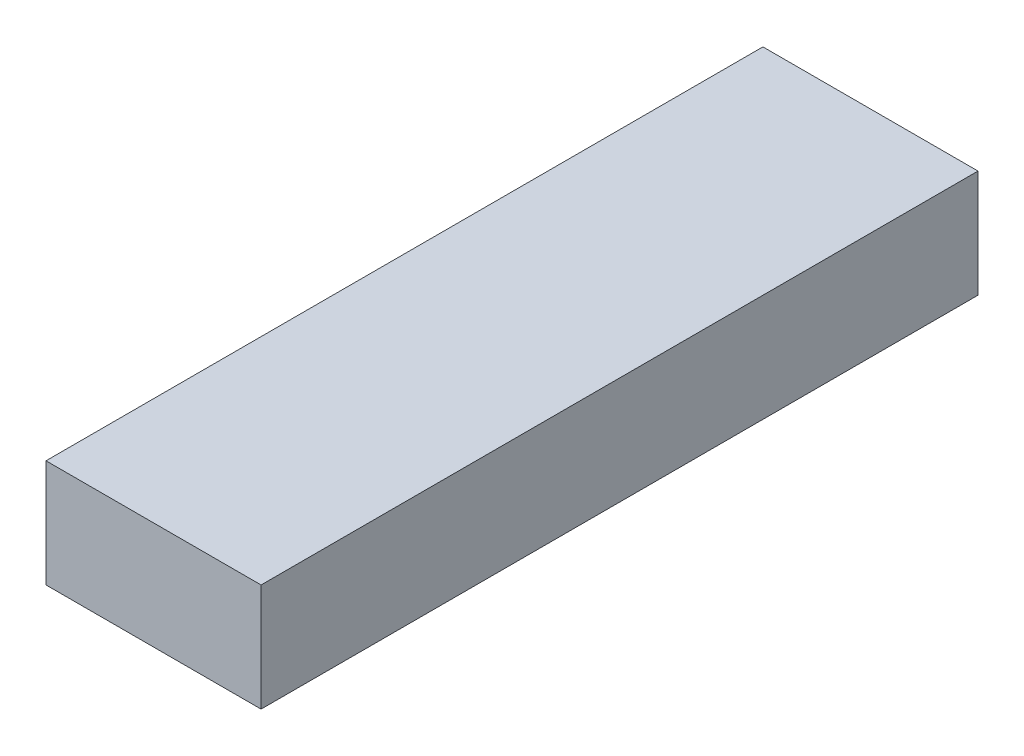
ISO-10303-21;
HEADER;
FILE_DESCRIPTION(('STEP AP214'),'2;1');
FILE_NAME('part.step','',(''),(''),'','','');
FILE_SCHEMA(('AUTOMOTIVE_DESIGN { 1 0 10303 214 1 1 1 1 }'));
ENDSEC;
DATA;
#1=APPLICATION_CONTEXT('core data for automotive mechanical design processes');
#2=APPLICATION_PROTOCOL_DEFINITION('international standard','automotive_design',2000,#1);
#3=PRODUCT_CONTEXT('',#1,'mechanical');
#4=PRODUCT('Part','Part','',(#3));
#5=PRODUCT_RELATED_PRODUCT_CATEGORY('part','',(#4));
#6=PRODUCT_DEFINITION_FORMATION('','',#4);
#7=PRODUCT_DEFINITION_CONTEXT('part definition',#1,'design');
#8=PRODUCT_DEFINITION('design','',#6,#7);
#9=PRODUCT_DEFINITION_SHAPE('','',#8);
#10=(LENGTH_UNIT() NAMED_UNIT(*) SI_UNIT(.MILLI.,.METRE.));
#11=(NAMED_UNIT(*) PLANE_ANGLE_UNIT() SI_UNIT($,.RADIAN.));
#12=(NAMED_UNIT(*) SI_UNIT($,.STERADIAN.) SOLID_ANGLE_UNIT());
#13=UNCERTAINTY_MEASURE_WITH_UNIT(LENGTH_MEASURE(1.E-05),#10,'distance_accuracy_value','');
#14=(GEOMETRIC_REPRESENTATION_CONTEXT(3) GLOBAL_UNCERTAINTY_ASSIGNED_CONTEXT((#13)) GLOBAL_UNIT_ASSIGNED_CONTEXT((#10,
#11,#12)) REPRESENTATION_CONTEXT('',''));
#15=CARTESIAN_POINT('',(0.,0.,0.));
#16=DIRECTION('',(0.,0.,1.));
#17=DIRECTION('',(1.,0.,0.));
#18=AXIS2_PLACEMENT_3D('',#15,#16,#17);
#19=CARTESIAN_POINT('',(-30.,15.,200.));
#20=DIRECTION('',(1.,0.,0.));
#21=DIRECTION('',(0.,0.,-1.));
#22=AXIS2_PLACEMENT_3D('',#19,#20,#21);
#23=PLANE('',#22);
#24=DIRECTION('',(0.,-1.,0.));
#25=VECTOR('',#24,1.);
#26=CARTESIAN_POINT('',(-30.,15.,0.));
#27=LINE('',#26,#25);
#28=CARTESIAN_POINT('',(-30.,15.,0.));
#29=VERTEX_POINT('',#28);
#30=CARTESIAN_POINT('',(-30.,-15.,0.));
#31=VERTEX_POINT('',#30);
#32=EDGE_CURVE('E96',#29,#31,#27,.T.);
#33=ORIENTED_EDGE('',*,*,#32,.T.);
#34=DIRECTION('',(0.,0.,-1.));
#35=VECTOR('',#34,1.);
#36=CARTESIAN_POINT('',(-30.,-15.,200.));
#37=LINE('',#36,#35);
#38=CARTESIAN_POINT('',(-30.,-15.,200.));
#39=VERTEX_POINT('',#38);
#40=EDGE_CURVE('E11',#39,#31,#37,.T.);
#41=ORIENTED_EDGE('',*,*,#40,.F.);
#42=DIRECTION('',(0.,-1.,0.));
#43=VECTOR('',#42,1.);
#44=CARTESIAN_POINT('',(-30.,15.,200.));
#45=LINE('',#44,#43);
#46=CARTESIAN_POINT('',(-30.,15.,200.));
#47=VERTEX_POINT('',#46);
#48=EDGE_CURVE('E84',#47,#39,#45,.T.);
#49=ORIENTED_EDGE('',*,*,#48,.F.);
#50=DIRECTION('',(0.,0.,-1.));
#51=VECTOR('',#50,1.);
#52=CARTESIAN_POINT('',(-30.,15.,200.));
#53=LINE('',#52,#51);
#54=EDGE_CURVE('E92',#47,#29,#53,.T.);
#55=ORIENTED_EDGE('',*,*,#54,.T.);
#56=EDGE_LOOP('',(#33,#41,#49,#55));
#57=FACE_BOUND('',#56,.T.);
#58=ADVANCED_FACE('F33',(#57),#23,.F.);
#59=CARTESIAN_POINT('',(-30.,-15.,200.));
#60=DIRECTION('',(0.,1.,0.));
#61=DIRECTION('',(-1.,0.,0.));
#62=AXIS2_PLACEMENT_3D('',#59,#60,#61);
#63=PLANE('',#62);
#64=DIRECTION('',(1.,0.,0.));
#65=VECTOR('',#64,1.);
#66=CARTESIAN_POINT('',(-30.,-15.,0.));
#67=LINE('',#66,#65);
#68=CARTESIAN_POINT('',(30.,-15.,0.));
#69=VERTEX_POINT('',#68);
#70=EDGE_CURVE('E88',#31,#69,#67,.T.);
#71=ORIENTED_EDGE('',*,*,#70,.T.);
#72=DIRECTION('',(0.,0.,-1.));
#73=VECTOR('',#72,1.);
#74=CARTESIAN_POINT('',(30.,-15.,200.));
#75=LINE('',#74,#73);
#76=CARTESIAN_POINT('',(30.,-15.,200.));
#77=VERTEX_POINT('',#76);
#78=EDGE_CURVE('E41',#77,#69,#75,.T.);
#79=ORIENTED_EDGE('',*,*,#78,.F.);
#80=DIRECTION('',(1.,0.,0.));
#81=VECTOR('',#80,1.);
#82=CARTESIAN_POINT('',(-30.,-15.,200.));
#83=LINE('',#82,#81);
#84=EDGE_CURVE('E79',#39,#77,#83,.T.);
#85=ORIENTED_EDGE('',*,*,#84,.F.);
#86=ORIENTED_EDGE('',*,*,#40,.T.);
#87=EDGE_LOOP('',(#71,#79,#85,#86));
#88=FACE_BOUND('',#87,.T.);
#89=ADVANCED_FACE('F87',(#88),#63,.F.);
#90=CARTESIAN_POINT('',(30.,15.,200.));
#91=DIRECTION('',(-1.,0.,0.));
#92=DIRECTION('',(0.,-1.,0.));
#93=AXIS2_PLACEMENT_3D('',#90,#91,#92);
#94=PLANE('',#93);
#95=DIRECTION('',(0.,1.,0.));
#96=VECTOR('',#95,1.);
#97=CARTESIAN_POINT('',(30.,15.,0.));
#98=LINE('',#97,#96);
#99=CARTESIAN_POINT('',(30.,15.,0.));
#100=VERTEX_POINT('',#99);
#101=EDGE_CURVE('E66',#69,#100,#98,.T.);
#102=ORIENTED_EDGE('',*,*,#101,.T.);
#103=DIRECTION('',(0.,0.,-1.));
#104=VECTOR('',#103,1.);
#105=CARTESIAN_POINT('',(30.,15.,200.));
#106=LINE('',#105,#104);
#107=CARTESIAN_POINT('',(30.,15.,200.));
#108=VERTEX_POINT('',#107);
#109=EDGE_CURVE('E89',#108,#100,#106,.T.);
#110=ORIENTED_EDGE('',*,*,#109,.F.);
#111=DIRECTION('',(0.,1.,0.));
#112=VECTOR('',#111,1.);
#113=CARTESIAN_POINT('',(30.,15.,200.));
#114=LINE('',#113,#112);
#115=EDGE_CURVE('E82',#77,#108,#114,.T.);
#116=ORIENTED_EDGE('',*,*,#115,.F.);
#117=ORIENTED_EDGE('',*,*,#78,.T.);
#118=EDGE_LOOP('',(#102,#110,#116,#117));
#119=FACE_BOUND('',#118,.T.);
#120=ADVANCED_FACE('F90',(#119),#94,.F.);
#121=CARTESIAN_POINT('',(-30.,15.,200.));
#122=DIRECTION('',(0.,-1.,0.));
#123=DIRECTION('',(0.,0.,-1.));
#124=AXIS2_PLACEMENT_3D('',#121,#122,#123);
#125=PLANE('',#124);
#126=DIRECTION('',(-1.,0.,0.));
#127=VECTOR('',#126,1.);
#128=CARTESIAN_POINT('',(-30.,15.,0.));
#129=LINE('',#128,#127);
#130=EDGE_CURVE('E72',#100,#29,#129,.T.);
#131=ORIENTED_EDGE('',*,*,#130,.T.);
#132=ORIENTED_EDGE('',*,*,#54,.F.);
#133=DIRECTION('',(-1.,0.,0.));
#134=VECTOR('',#133,1.);
#135=CARTESIAN_POINT('',(-30.,15.,200.));
#136=LINE('',#135,#134);
#137=EDGE_CURVE('E49',#108,#47,#136,.T.);
#138=ORIENTED_EDGE('',*,*,#137,.F.);
#139=ORIENTED_EDGE('',*,*,#109,.T.);
#140=EDGE_LOOP('',(#131,#132,#138,#139));
#141=FACE_BOUND('',#140,.T.);
#142=ADVANCED_FACE('F103',(#141),#125,.F.);
#143=CARTESIAN_POINT('',(0.,0.,200.));
#144=DIRECTION('',(0.,0.,1.));
#145=DIRECTION('',(1.,0.,0.));
#146=AXIS2_PLACEMENT_3D('',#143,#144,#145);
#147=PLANE('',#146);
#148=ORIENTED_EDGE('',*,*,#48,.T.);
#149=ORIENTED_EDGE('',*,*,#84,.T.);
#150=ORIENTED_EDGE('',*,*,#115,.T.);
#151=ORIENTED_EDGE('',*,*,#137,.T.);
#152=EDGE_LOOP('',(#148,#149,#150,#151));
#153=FACE_BOUND('',#152,.T.);
#154=ADVANCED_FACE('F80',(#153),#147,.T.);
#155=CARTESIAN_POINT('',(0.,0.,0.));
#156=DIRECTION('',(0.,0.,1.));
#157=DIRECTION('',(1.,0.,0.));
#158=AXIS2_PLACEMENT_3D('',#155,#156,#157);
#159=PLANE('',#158);
#160=ORIENTED_EDGE('',*,*,#32,.F.);
#161=ORIENTED_EDGE('',*,*,#130,.F.);
#162=ORIENTED_EDGE('',*,*,#101,.F.);
#163=ORIENTED_EDGE('',*,*,#70,.F.);
#164=EDGE_LOOP('',(#160,#161,#162,#163));
#165=FACE_BOUND('',#164,.T.);
#166=ADVANCED_FACE('F106',(#165),#159,.F.);
#167=CLOSED_SHELL('',(#58,#89,#120,#142,#154,#166));
#168=MANIFOLD_SOLID_BREP('B2',#167);
#169=ADVANCED_BREP_SHAPE_REPRESENTATION('',(#18,#168),#14);
#170=SHAPE_DEFINITION_REPRESENTATION(#9,#169);
ENDSEC;
END-ISO-10303-21;
